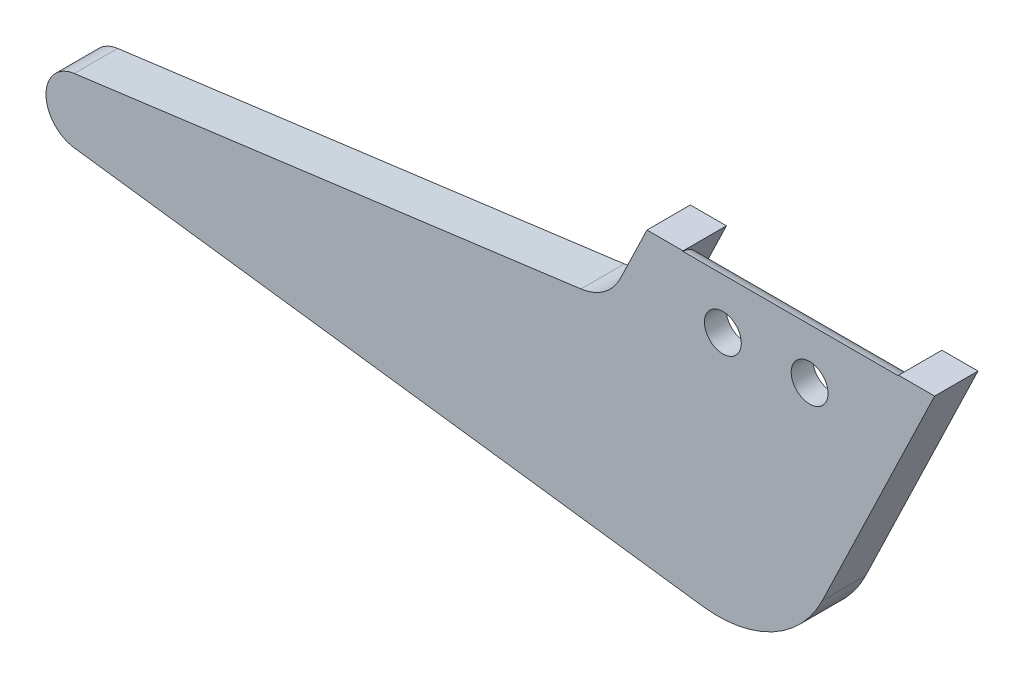
ISO-10303-21;
HEADER;
FILE_DESCRIPTION(('STEP AP214'),'2;1');
FILE_NAME('part.step','',(''),(''),'','','');
FILE_SCHEMA(('AUTOMOTIVE_DESIGN { 1 0 10303 214 1 1 1 1 }'));
ENDSEC;
DATA;
#1=APPLICATION_CONTEXT('core data for automotive mechanical design processes');
#2=APPLICATION_PROTOCOL_DEFINITION('international standard','automotive_design',2000,#1);
#3=PRODUCT_CONTEXT('',#1,'mechanical');
#4=PRODUCT('Part','Part','',(#3));
#5=PRODUCT_RELATED_PRODUCT_CATEGORY('part','',(#4));
#6=PRODUCT_DEFINITION_FORMATION('','',#4);
#7=PRODUCT_DEFINITION_CONTEXT('part definition',#1,'design');
#8=PRODUCT_DEFINITION('design','',#6,#7);
#9=PRODUCT_DEFINITION_SHAPE('','',#8);
#10=(LENGTH_UNIT() NAMED_UNIT(*) SI_UNIT(.MILLI.,.METRE.));
#11=(NAMED_UNIT(*) PLANE_ANGLE_UNIT() SI_UNIT($,.RADIAN.));
#12=(NAMED_UNIT(*) SI_UNIT($,.STERADIAN.) SOLID_ANGLE_UNIT());
#13=UNCERTAINTY_MEASURE_WITH_UNIT(LENGTH_MEASURE(1.E-05),#10,'distance_accuracy_value','');
#14=(GEOMETRIC_REPRESENTATION_CONTEXT(3) GLOBAL_UNCERTAINTY_ASSIGNED_CONTEXT((#13)) GLOBAL_UNIT_ASSIGNED_CONTEXT((#10,
#11,#12)) REPRESENTATION_CONTEXT('',''));
#15=CARTESIAN_POINT('',(0.,0.,0.));
#16=DIRECTION('',(0.,0.,1.));
#17=DIRECTION('',(1.,0.,0.));
#18=AXIS2_PLACEMENT_3D('',#15,#16,#17);
#19=CARTESIAN_POINT('',(0.,16.875533228522,2.));
#20=DIRECTION('',(0.,-1.,0.));
#21=DIRECTION('',(0.,0.,-1.));
#22=AXIS2_PLACEMENT_3D('',#19,#20,#21);
#23=PLANE('',#22);
#24=DIRECTION('',(-1.,0.,0.));
#25=VECTOR('',#24,1.);
#26=CARTESIAN_POINT('',(0.,16.875533228522,2.));
#27=LINE('',#26,#25);
#28=CARTESIAN_POINT('',(-3.2021710332918,16.875533228522,2.));
#29=VERTEX_POINT('',#28);
#30=CARTESIAN_POINT('',(-6.53175349323844,16.875533228522,2.));
#31=VERTEX_POINT('',#30);
#32=EDGE_CURVE('E267',#29,#31,#27,.T.);
#33=ORIENTED_EDGE('',*,*,#32,.F.);
#34=DIRECTION('',(0.,0.,1.));
#35=VECTOR('',#34,1.);
#36=CARTESIAN_POINT('',(-3.2021710332918,16.875533228522,-2.));
#37=LINE('',#36,#35);
#38=CARTESIAN_POINT('',(-3.2021710332918,16.875533228522,-2.));
#39=VERTEX_POINT('',#38);
#40=EDGE_CURVE('E241',#39,#29,#37,.T.);
#41=ORIENTED_EDGE('',*,*,#40,.F.);
#42=DIRECTION('',(-1.,0.,0.));
#43=VECTOR('',#42,1.);
#44=CARTESIAN_POINT('',(0.,16.875533228522,-2.));
#45=LINE('',#44,#43);
#46=CARTESIAN_POINT('',(-6.53175349323844,16.875533228522,-2.));
#47=VERTEX_POINT('',#46);
#48=EDGE_CURVE('E205',#39,#47,#45,.T.);
#49=ORIENTED_EDGE('',*,*,#48,.T.);
#50=DIRECTION('',(0.,0.,-1.));
#51=VECTOR('',#50,1.);
#52=CARTESIAN_POINT('',(-6.53175349323844,16.875533228522,2.));
#53=LINE('',#52,#51);
#54=EDGE_CURVE('E304',#31,#47,#53,.T.);
#55=ORIENTED_EDGE('',*,*,#54,.F.);
#56=EDGE_LOOP('',(#33,#41,#49,#55));
#57=FACE_BOUND('',#56,.T.);
#58=ADVANCED_FACE('F41',(#57),#23,.F.);
#59=DIRECTION('',(0.,0.,1.));
#60=VECTOR('',#59,1.);
#61=CARTESIAN_POINT('',(16.6637454586975,16.875533228522,-2.));
#62=LINE('',#61,#60);
#63=CARTESIAN_POINT('',(16.6637454586975,16.875533228522,-2.));
#64=VERTEX_POINT('',#63);
#65=CARTESIAN_POINT('',(16.6637454586975,16.875533228522,2.));
#66=VERTEX_POINT('',#65);
#67=EDGE_CURVE('E56',#64,#66,#62,.T.);
#68=ORIENTED_EDGE('',*,*,#67,.T.);
#69=CARTESIAN_POINT('',(19.9933279186442,16.875533228522,2.));
#70=VERTEX_POINT('',#69);
#71=EDGE_CURVE('E263',#70,#66,#27,.T.);
#72=ORIENTED_EDGE('',*,*,#71,.F.);
#73=DIRECTION('',(0.,0.,-1.));
#74=VECTOR('',#73,1.);
#75=CARTESIAN_POINT('',(19.9933279186442,16.875533228522,2.));
#76=LINE('',#75,#74);
#77=CARTESIAN_POINT('',(19.9933279186442,16.875533228522,-2.));
#78=VERTEX_POINT('',#77);
#79=EDGE_CURVE('E289',#70,#78,#76,.T.);
#80=ORIENTED_EDGE('',*,*,#79,.T.);
#81=EDGE_CURVE('E202',#78,#64,#45,.T.);
#82=ORIENTED_EDGE('',*,*,#81,.T.);
#83=EDGE_LOOP('',(#68,#72,#80,#82));
#84=FACE_BOUND('',#83,.T.);
#85=ADVANCED_FACE('F379',(#84),#23,.F.);
#86=CARTESIAN_POINT('',(-11.8984672041856,5.72847918898119,2.));
#87=DIRECTION('',(0.901013876691335,-0.433790265001016,0.));
#88=DIRECTION('',(0.433790265001016,0.901013876691335,0.));
#89=AXIS2_PLACEMENT_3D('',#86,#87,#88);
#90=PLANE('',#89);
#91=ORIENTED_EDGE('',*,*,#54,.T.);
#92=DIRECTION('',(-0.433790265001016,-0.901013876691335,0.));
#93=VECTOR('',#92,1.);
#94=CARTESIAN_POINT('',(-11.8984672041856,5.72847918898119,-2.));
#95=LINE('',#94,#93);
#96=CARTESIAN_POINT('',(-9.0017238432525,11.7452254739817,-2.));
#97=VERTEX_POINT('',#96);
#98=EDGE_CURVE('E222',#47,#97,#95,.T.);
#99=ORIENTED_EDGE('',*,*,#98,.T.);
#100=DIRECTION('',(0.,0.,-1.));
#101=VECTOR('',#100,1.);
#102=CARTESIAN_POINT('',(-9.0017238432525,11.7452254739817,2.));
#103=LINE('',#102,#101);
#104=CARTESIAN_POINT('',(-9.0017238432525,11.7452254739817,2.));
#105=VERTEX_POINT('',#104);
#106=EDGE_CURVE('E302',#105,#97,#103,.T.);
#107=ORIENTED_EDGE('',*,*,#106,.F.);
#108=DIRECTION('',(-0.433790265001016,-0.901013876691335,0.));
#109=VECTOR('',#108,1.);
#110=CARTESIAN_POINT('',(-11.8984672041856,5.72847918898119,2.));
#111=LINE('',#110,#109);
#112=EDGE_CURVE('E266',#31,#105,#111,.T.);
#113=ORIENTED_EDGE('',*,*,#112,.F.);
#114=EDGE_LOOP('',(#91,#99,#107,#113));
#115=FACE_BOUND('',#114,.T.);
#116=ADVANCED_FACE('F362',(#115),#90,.F.);
#117=CARTESIAN_POINT('',(-13.2364890637018,13.7840397194865,2.));
#118=DIRECTION('',(0.,0.,-1.));
#119=DIRECTION('',(-1.,0.,0.));
#120=AXIS2_PLACEMENT_3D('',#117,#118,#119);
#121=CYLINDRICAL_SURFACE('',#120,4.7);
#122=ORIENTED_EDGE('',*,*,#106,.T.);
#123=CARTESIAN_POINT('',(-13.2364890637018,13.7840397194865,-2.));
#124=DIRECTION('',(0.,0.,1.));
#125=DIRECTION('',(1.,0.,0.));
#126=AXIS2_PLACEMENT_3D('',#123,#124,#125);
#127=CIRCLE('',#126,4.7);
#128=CARTESIAN_POINT('',(-12.6230159602675,9.12424887102956,-2.));
#129=VERTEX_POINT('',#128);
#130=EDGE_CURVE('E225',#97,#129,#127,.F.);
#131=ORIENTED_EDGE('',*,*,#130,.T.);
#132=DIRECTION('',(0.,0.,-1.));
#133=VECTOR('',#132,1.);
#134=CARTESIAN_POINT('',(-12.6230159602675,9.12424887102956,2.));
#135=LINE('',#134,#133);
#136=CARTESIAN_POINT('',(-12.6230159602675,9.12424887102956,2.));
#137=VERTEX_POINT('',#136);
#138=EDGE_CURVE('E175',#137,#129,#135,.T.);
#139=ORIENTED_EDGE('',*,*,#138,.F.);
#140=CARTESIAN_POINT('',(-13.2364890637018,13.7840397194865,2.));
#141=DIRECTION('',(0.,0.,1.));
#142=DIRECTION('',(1.,0.,0.));
#143=AXIS2_PLACEMENT_3D('',#140,#141,#142);
#144=CIRCLE('',#143,4.7);
#145=EDGE_CURVE('E269',#105,#137,#144,.F.);
#146=ORIENTED_EDGE('',*,*,#145,.F.);
#147=EDGE_LOOP('',(#122,#131,#139,#146));
#148=FACE_BOUND('',#147,.T.);
#149=ADVANCED_FACE('F365',(#148),#121,.F.);
#150=CARTESIAN_POINT('',(-1.39582410933184,10.6023367190981,2.));
#151=DIRECTION('',(0.130526192220053,-0.99144486137381,0.));
#152=DIRECTION('',(0.99144486137381,0.130526192220053,0.));
#153=AXIS2_PLACEMENT_3D('',#150,#151,#152);
#154=PLANE('',#153);
#155=ORIENTED_EDGE('',*,*,#138,.T.);
#156=DIRECTION('',(-0.99144486137381,-0.130526192220053,0.));
#157=VECTOR('',#156,1.);
#158=CARTESIAN_POINT('',(-1.39582410933184,10.6023367190981,-2.));
#159=LINE('',#158,#157);
#160=CARTESIAN_POINT('',(-59.3362526979567,2.97433458412143,-2.));
#161=VERTEX_POINT('',#160);
#162=EDGE_CURVE('E183',#129,#161,#159,.T.);
#163=ORIENTED_EDGE('',*,*,#162,.T.);
#164=DIRECTION('',(0.,0.,-1.));
#165=VECTOR('',#164,1.);
#166=CARTESIAN_POINT('',(-59.3362526979567,2.97433458412143,2.));
#167=LINE('',#166,#165);
#168=CARTESIAN_POINT('',(-59.3362526979567,2.97433458412143,2.));
#169=VERTEX_POINT('',#168);
#170=EDGE_CURVE('E166',#169,#161,#167,.T.);
#171=ORIENTED_EDGE('',*,*,#170,.F.);
#172=DIRECTION('',(-0.99144486137381,-0.130526192220053,0.));
#173=VECTOR('',#172,1.);
#174=CARTESIAN_POINT('',(-1.39582410933184,10.6023367190981,2.));
#175=LINE('',#174,#173);
#176=EDGE_CURVE('E271',#137,#169,#175,.T.);
#177=ORIENTED_EDGE('',*,*,#176,.F.);
#178=EDGE_LOOP('',(#155,#163,#171,#177));
#179=FACE_BOUND('',#178,.T.);
#180=ADVANCED_FACE('F189',(#179),#154,.F.);
#181=CARTESIAN_POINT('',(-58.9446741212965,0.,2.));
#182=DIRECTION('',(0.,0.,-1.));
#183=DIRECTION('',(-1.,0.,0.));
#184=AXIS2_PLACEMENT_3D('',#181,#182,#183);
#185=CYLINDRICAL_SURFACE('',#184,3.);
#186=ORIENTED_EDGE('',*,*,#170,.T.);
#187=CARTESIAN_POINT('',(-58.9446741212965,0.,-2.));
#188=DIRECTION('',(0.,0.,1.));
#189=DIRECTION('',(1.,0.,0.));
#190=AXIS2_PLACEMENT_3D('',#187,#188,#189);
#191=CIRCLE('',#190,3.);
#192=CARTESIAN_POINT('',(-59.3362526979567,-2.97433458412143,-2.));
#193=VERTEX_POINT('',#192);
#194=EDGE_CURVE('E170',#161,#193,#191,.T.);
#195=ORIENTED_EDGE('',*,*,#194,.T.);
#196=DIRECTION('',(0.,0.,-1.));
#197=VECTOR('',#196,1.);
#198=CARTESIAN_POINT('',(-59.3362526979567,-2.97433458412143,2.));
#199=LINE('',#198,#197);
#200=CARTESIAN_POINT('',(-59.3362526979567,-2.97433458412143,2.));
#201=VERTEX_POINT('',#200);
#202=EDGE_CURVE('E176',#201,#193,#199,.T.);
#203=ORIENTED_EDGE('',*,*,#202,.F.);
#204=CARTESIAN_POINT('',(-58.9446741212965,0.,2.));
#205=DIRECTION('',(0.,0.,1.));
#206=DIRECTION('',(1.,0.,0.));
#207=AXIS2_PLACEMENT_3D('',#204,#205,#206);
#208=CIRCLE('',#207,3.);
#209=EDGE_CURVE('E171',#169,#201,#208,.T.);
#210=ORIENTED_EDGE('',*,*,#209,.F.);
#211=EDGE_LOOP('',(#186,#195,#203,#210));
#212=FACE_BOUND('',#211,.T.);
#213=ADVANCED_FACE('F168',(#212),#185,.T.);
#214=CARTESIAN_POINT('',(-1.39582410933184,-10.6023367190981,2.));
#215=DIRECTION('',(-0.130526192220053,-0.99144486137381,0.));
#216=DIRECTION('',(0.99144486137381,-0.130526192220053,0.));
#217=AXIS2_PLACEMENT_3D('',#214,#215,#216);
#218=PLANE('',#217);
#219=ORIENTED_EDGE('',*,*,#202,.T.);
#220=DIRECTION('',(-0.99144486137381,0.130526192220053,0.));
#221=VECTOR('',#220,1.);
#222=CARTESIAN_POINT('',(-1.39582410933184,-10.6023367190981,-2.));
#223=LINE('',#222,#221);
#224=CARTESIAN_POINT('',(-1.39582410933183,-10.6023367190981,-2.));
#225=VERTEX_POINT('',#224);
#226=EDGE_CURVE('E187',#225,#193,#223,.T.);
#227=ORIENTED_EDGE('',*,*,#226,.F.);
#228=DIRECTION('',(0.,0.,-1.));
#229=VECTOR('',#228,1.);
#230=CARTESIAN_POINT('',(-1.39582410933183,-10.6023367190981,2.));
#231=LINE('',#230,#229);
#232=CARTESIAN_POINT('',(-1.39582410933183,-10.6023367190981,2.));
#233=VERTEX_POINT('',#232);
#234=EDGE_CURVE('E298',#233,#225,#231,.T.);
#235=ORIENTED_EDGE('',*,*,#234,.F.);
#236=DIRECTION('',(-0.99144486137381,0.130526192220053,0.));
#237=VECTOR('',#236,1.);
#238=CARTESIAN_POINT('',(-1.39582410933184,-10.6023367190981,2.));
#239=LINE('',#238,#237);
#240=EDGE_CURVE('E274',#233,#201,#239,.T.);
#241=ORIENTED_EDGE('',*,*,#240,.T.);
#242=EDGE_LOOP('',(#219,#227,#235,#241));
#243=FACE_BOUND('',#242,.T.);
#244=ADVANCED_FACE('F369',(#243),#218,.T.);
#245=CARTESIAN_POINT('',(0.,0.,2.));
#246=DIRECTION('',(0.,0.,-1.));
#247=DIRECTION('',(-1.,0.,0.));
#248=AXIS2_PLACEMENT_3D('',#245,#246,#247);
#249=CYLINDRICAL_SURFACE('',#248,10.6938238647047);
#250=ORIENTED_EDGE('',*,*,#234,.T.);
#251=CARTESIAN_POINT('',(0.,0.,-2.));
#252=DIRECTION('',(0.,0.,1.));
#253=DIRECTION('',(1.,0.,0.));
#254=AXIS2_PLACEMENT_3D('',#251,#252,#253);
#255=CIRCLE('',#254,10.6938238647047);
#256=CARTESIAN_POINT('',(9.63528369699188,-4.63887668814443,-2.));
#257=VERTEX_POINT('',#256);
#258=EDGE_CURVE('E197',#257,#225,#255,.F.);
#259=ORIENTED_EDGE('',*,*,#258,.F.);
#260=DIRECTION('',(0.,0.,-1.));
#261=VECTOR('',#260,1.);
#262=CARTESIAN_POINT('',(9.63528369699188,-4.63887668814443,2.));
#263=LINE('',#262,#261);
#264=CARTESIAN_POINT('',(9.63528369699188,-4.63887668814443,2.));
#265=VERTEX_POINT('',#264);
#266=EDGE_CURVE('E296',#265,#257,#263,.T.);
#267=ORIENTED_EDGE('',*,*,#266,.F.);
#268=CARTESIAN_POINT('',(0.,0.,2.));
#269=DIRECTION('',(0.,0.,1.));
#270=DIRECTION('',(1.,0.,0.));
#271=AXIS2_PLACEMENT_3D('',#268,#269,#270);
#272=CIRCLE('',#271,10.6938238647047);
#273=EDGE_CURVE('E277',#265,#233,#272,.F.);
#274=ORIENTED_EDGE('',*,*,#273,.T.);
#275=EDGE_LOOP('',(#250,#259,#267,#274));
#276=FACE_BOUND('',#275,.T.);
#277=ADVANCED_FACE('F372',(#276),#249,.T.);
#278=CARTESIAN_POINT('',(8.46798716239551,12.175533228522,2.));
#279=DIRECTION('',(0.,0.,-1.));
#280=DIRECTION('',(-1.,0.,0.));
#281=AXIS2_PLACEMENT_3D('',#278,#279,#280);
#282=CYLINDRICAL_SURFACE('',#281,1.7);
#283=CARTESIAN_POINT('',(8.46798716239551,12.175533228522,2.));
#284=DIRECTION('',(0.,0.,1.));
#285=DIRECTION('',(1.,0.,0.));
#286=AXIS2_PLACEMENT_3D('',#283,#284,#285);
#287=CIRCLE('',#286,1.7);
#288=CARTESIAN_POINT('',(10.1679871623955,12.175533228522,2.));
#289=VERTEX_POINT('',#288);
#290=EDGE_CURVE('E283',#289,#289,#287,.T.);
#291=ORIENTED_EDGE('',*,*,#290,.T.);
#292=EDGE_LOOP('',(#291));
#293=FACE_BOUND('',#292,.T.);
#294=CARTESIAN_POINT('',(8.46798716239551,12.175533228522,0.));
#295=DIRECTION('',(0.,0.,1.));
#296=DIRECTION('',(1.,0.,0.));
#297=AXIS2_PLACEMENT_3D('',#294,#295,#296);
#298=CIRCLE('',#297,1.7);
#299=CARTESIAN_POINT('',(10.1679871623955,12.175533228522,0.));
#300=VERTEX_POINT('',#299);
#301=EDGE_CURVE('E243',#300,#300,#298,.T.);
#302=ORIENTED_EDGE('',*,*,#301,.F.);
#303=EDGE_LOOP('',(#302));
#304=FACE_BOUND('',#303,.T.);
#305=ADVANCED_FACE('F398',(#293,#304),#282,.F.);
#306=CARTESIAN_POINT('',(9.63528369699188,-4.63887668814442,2.));
#307=DIRECTION('',(0.901013876691335,-0.433790265001015,0.));
#308=DIRECTION('',(0.433790265001015,0.901013876691335,0.));
#309=AXIS2_PLACEMENT_3D('',#306,#307,#308);
#310=PLANE('',#309);
#311=ORIENTED_EDGE('',*,*,#266,.T.);
#312=DIRECTION('',(-0.433790265001015,-0.901013876691335,0.));
#313=VECTOR('',#312,1.);
#314=CARTESIAN_POINT('',(9.63528369699188,-4.63887668814442,-2.));
#315=LINE('',#314,#313);
#316=EDGE_CURVE('E199',#78,#257,#315,.T.);
#317=ORIENTED_EDGE('',*,*,#316,.F.);
#318=ORIENTED_EDGE('',*,*,#79,.F.);
#319=DIRECTION('',(-0.433790265001015,-0.901013876691335,0.));
#320=VECTOR('',#319,1.);
#321=CARTESIAN_POINT('',(9.63528369699188,-4.63887668814442,2.));
#322=LINE('',#321,#320);
#323=EDGE_CURVE('E280',#70,#265,#322,.T.);
#324=ORIENTED_EDGE('',*,*,#323,.T.);
#325=EDGE_LOOP('',(#311,#317,#318,#324));
#326=FACE_BOUND('',#325,.T.);
#327=ADVANCED_FACE('F376',(#326),#310,.T.);
#328=CARTESIAN_POINT('',(0.467987162395512,12.175533228522,2.));
#329=DIRECTION('',(0.,0.,-1.));
#330=DIRECTION('',(-1.,0.,0.));
#331=AXIS2_PLACEMENT_3D('',#328,#329,#330);
#332=CYLINDRICAL_SURFACE('',#331,1.7);
#333=CARTESIAN_POINT('',(0.467987162395512,12.175533228522,2.));
#334=DIRECTION('',(0.,0.,1.));
#335=DIRECTION('',(1.,0.,0.));
#336=AXIS2_PLACEMENT_3D('',#333,#334,#335);
#337=CIRCLE('',#336,1.7);
#338=CARTESIAN_POINT('',(2.16798716239551,12.175533228522,2.));
#339=VERTEX_POINT('',#338);
#340=EDGE_CURVE('E286',#339,#339,#337,.T.);
#341=ORIENTED_EDGE('',*,*,#340,.T.);
#342=EDGE_LOOP('',(#341));
#343=FACE_BOUND('',#342,.T.);
#344=CARTESIAN_POINT('',(0.467987162395512,12.175533228522,0.));
#345=DIRECTION('',(0.,0.,1.));
#346=DIRECTION('',(1.,0.,0.));
#347=AXIS2_PLACEMENT_3D('',#344,#345,#346);
#348=CIRCLE('',#347,1.7);
#349=CARTESIAN_POINT('',(2.16798716239551,12.175533228522,0.));
#350=VERTEX_POINT('',#349);
#351=EDGE_CURVE('E292',#350,#350,#348,.T.);
#352=ORIENTED_EDGE('',*,*,#351,.F.);
#353=EDGE_LOOP('',(#352));
#354=FACE_BOUND('',#353,.T.);
#355=ADVANCED_FACE('F401',(#343,#354),#332,.F.);
#356=CARTESIAN_POINT('',(0.,0.,2.));
#357=DIRECTION('',(0.,0.,1.));
#358=DIRECTION('',(1.,0.,0.));
#359=AXIS2_PLACEMENT_3D('',#356,#357,#358);
#360=PLANE('',#359);
#361=DIRECTION('',(-1.,0.,0.));
#362=VECTOR('',#361,1.);
#363=CARTESIAN_POINT('',(6.70646921002812,16.8250229713052,2.));
#364=LINE('',#363,#362);
#365=CARTESIAN_POINT('',(16.6394274560228,16.8250229713052,2.));
#366=VERTEX_POINT('',#365);
#367=CARTESIAN_POINT('',(-3.22648903596654,16.8250229713052,2.));
#368=VERTEX_POINT('',#367);
#369=EDGE_CURVE('E309',#366,#368,#364,.T.);
#370=ORIENTED_EDGE('',*,*,#369,.T.);
#371=DIRECTION('',(0.433790265001016,0.901013876691335,0.));
#372=VECTOR('',#371,1.);
#373=CARTESIAN_POINT('',(-9.19542557411162,4.42710839397814,2.));
#374=LINE('',#373,#372);
#375=EDGE_CURVE('E312',#368,#29,#374,.T.);
#376=ORIENTED_EDGE('',*,*,#375,.T.);
#377=ORIENTED_EDGE('',*,*,#32,.T.);
#378=ORIENTED_EDGE('',*,*,#112,.T.);
#379=ORIENTED_EDGE('',*,*,#145,.T.);
#380=ORIENTED_EDGE('',*,*,#176,.T.);
#381=ORIENTED_EDGE('',*,*,#209,.T.);
#382=ORIENTED_EDGE('',*,*,#240,.F.);
#383=ORIENTED_EDGE('',*,*,#273,.F.);
#384=ORIENTED_EDGE('',*,*,#323,.F.);
#385=ORIENTED_EDGE('',*,*,#71,.T.);
#386=DIRECTION('',(-0.433790265001015,-0.901013876691335,0.));
#387=VECTOR('',#386,1.);
#388=CARTESIAN_POINT('',(6.93224206691787,-3.33750589314138,2.));
#389=LINE('',#388,#387);
#390=EDGE_CURVE('E306',#66,#366,#389,.T.);
#391=ORIENTED_EDGE('',*,*,#390,.T.);
#392=EDGE_LOOP('',(#370,#376,#377,#378,#379,#380,#381,#382,#383,#384,#385,#391));
#393=FACE_BOUND('',#392,.T.);
#394=ORIENTED_EDGE('',*,*,#290,.F.);
#395=EDGE_LOOP('',(#394));
#396=FACE_BOUND('',#395,.T.);
#397=ORIENTED_EDGE('',*,*,#340,.F.);
#398=EDGE_LOOP('',(#397));
#399=FACE_BOUND('',#398,.T.);
#400=ADVANCED_FACE('F358',(#393,#396,#399),#360,.T.);
#401=CARTESIAN_POINT('',(0.,0.,0.));
#402=DIRECTION('',(0.,0.,1.));
#403=DIRECTION('',(1.,0.,0.));
#404=AXIS2_PLACEMENT_3D('',#401,#402,#403);
#405=PLANE('',#404);
#406=DIRECTION('',(-0.433790265001016,-0.901013876691335,0.));
#407=VECTOR('',#406,1.);
#408=CARTESIAN_POINT('',(-9.19542557411162,4.42710839397814,0.));
#409=LINE('',#408,#407);
#410=CARTESIAN_POINT('',(-4.40578808132762,14.375533228522,0.));
#411=VERTEX_POINT('',#410);
#412=CARTESIAN_POINT('',(-6.2986822131785,10.4438546789786,0.));
#413=VERTEX_POINT('',#412);
#414=EDGE_CURVE('E191',#411,#413,#409,.T.);
#415=ORIENTED_EDGE('',*,*,#414,.F.);
#416=DIRECTION('',(-1.,0.,0.));
#417=VECTOR('',#416,1.);
#418=CARTESIAN_POINT('',(0.,14.375533228522,0.));
#419=LINE('',#418,#417);
#420=CARTESIAN_POINT('',(15.4601284106617,14.375533228522,0.));
#421=VERTEX_POINT('',#420);
#422=EDGE_CURVE('E315',#411,#421,#419,.F.);
#423=ORIENTED_EDGE('',*,*,#422,.T.);
#424=DIRECTION('',(-0.433790265001015,-0.901013876691335,0.));
#425=VECTOR('',#424,1.);
#426=CARTESIAN_POINT('',(6.93224206691787,-3.33750589314138,0.));
#427=LINE('',#426,#425);
#428=CARTESIAN_POINT('',(6.93224206691787,-3.33750589314138,0.));
#429=VERTEX_POINT('',#428);
#430=EDGE_CURVE('E227',#421,#429,#427,.T.);
#431=ORIENTED_EDGE('',*,*,#430,.T.);
#432=CARTESIAN_POINT('',(0.,0.,0.));
#433=DIRECTION('',(0.,0.,1.));
#434=DIRECTION('',(1.,0.,0.));
#435=AXIS2_PLACEMENT_3D('',#432,#433,#434);
#436=CIRCLE('',#435,7.69382386470471);
#437=CARTESIAN_POINT('',(-1.00424553267167,-7.6280021349767,0.));
#438=VERTEX_POINT('',#437);
#439=EDGE_CURVE('E229',#429,#438,#436,.F.);
#440=ORIENTED_EDGE('',*,*,#439,.T.);
#441=DIRECTION('',(-0.99144486137381,0.130526192220053,0.));
#442=VECTOR('',#441,1.);
#443=CARTESIAN_POINT('',(-1.00424553267168,-7.6280021349767,0.));
#444=LINE('',#443,#442);
#445=CARTESIAN_POINT('',(-51.4139027379762,-0.991444861373811,0.));
#446=VERTEX_POINT('',#445);
#447=EDGE_CURVE('E231',#438,#446,#444,.T.);
#448=ORIENTED_EDGE('',*,*,#447,.T.);
#449=CARTESIAN_POINT('',(-51.2833765457561,0.,0.));
#450=DIRECTION('',(0.,0.,1.));
#451=DIRECTION('',(1.,0.,0.));
#452=AXIS2_PLACEMENT_3D('',#449,#450,#451);
#453=CIRCLE('',#452,1.);
#454=CARTESIAN_POINT('',(-51.4139027379762,0.991444861373812,0.));
#455=VERTEX_POINT('',#454);
#456=EDGE_CURVE('E233',#455,#446,#453,.T.);
#457=ORIENTED_EDGE('',*,*,#456,.F.);
#458=DIRECTION('',(-0.99144486137381,-0.130526192220053,0.));
#459=VECTOR('',#458,1.);
#460=CARTESIAN_POINT('',(-1.00424553267168,7.62800213497668,0.));
#461=LINE('',#460,#459);
#462=CARTESIAN_POINT('',(-12.2314373836074,6.14991428690812,0.));
#463=VERTEX_POINT('',#462);
#464=EDGE_CURVE('E236',#463,#455,#461,.T.);
#465=ORIENTED_EDGE('',*,*,#464,.F.);
#466=CARTESIAN_POINT('',(-13.2364890637018,13.7840397194865,0.));
#467=DIRECTION('',(0.,0.,1.));
#468=DIRECTION('',(1.,0.,0.));
#469=AXIS2_PLACEMENT_3D('',#466,#467,#468);
#470=CIRCLE('',#469,7.70000000000001);
#471=EDGE_CURVE('E193',#413,#463,#470,.F.);
#472=ORIENTED_EDGE('',*,*,#471,.F.);
#473=EDGE_LOOP('',(#415,#423,#431,#440,#448,#457,#465,#472));
#474=FACE_BOUND('',#473,.T.);
#475=ORIENTED_EDGE('',*,*,#301,.T.);
#476=EDGE_LOOP('',(#475));
#477=FACE_BOUND('',#476,.T.);
#478=ORIENTED_EDGE('',*,*,#351,.T.);
#479=EDGE_LOOP('',(#478));
#480=FACE_BOUND('',#479,.T.);
#481=ADVANCED_FACE('F320',(#474,#477,#480),#405,.F.);
#482=CARTESIAN_POINT('',(-9.19542557411162,4.42710839397814,-2.));
#483=DIRECTION('',(-0.901013876691335,0.433790265001015,0.));
#484=DIRECTION('',(-0.433790265001016,-0.901013876691335,0.));
#485=AXIS2_PLACEMENT_3D('',#482,#483,#484);
#486=PLANE('',#485);
#487=ORIENTED_EDGE('',*,*,#40,.T.);
#488=ORIENTED_EDGE('',*,*,#375,.F.);
#489=CARTESIAN_POINT('',(-4.40578808132763,14.375533228522,2.5));
#490=DIRECTION('',(-0.901013876691335,0.433790265001015,0.));
#491=DIRECTION('',(-0.433790265001016,-0.901013876691335,0.));
#492=AXIS2_PLACEMENT_3D('',#489,#490,#491);
#493=ELLIPSE('',#492,2.77465204995554,2.5);
#494=EDGE_CURVE('E49',#368,#411,#493,.T.);
#495=ORIENTED_EDGE('',*,*,#494,.T.);
#496=ORIENTED_EDGE('',*,*,#414,.T.);
#497=DIRECTION('',(0.,0.,1.));
#498=VECTOR('',#497,1.);
#499=CARTESIAN_POINT('',(-6.2986822131785,10.4438546789786,-2.));
#500=LINE('',#499,#498);
#501=CARTESIAN_POINT('',(-6.2986822131785,10.4438546789786,-2.));
#502=VERTEX_POINT('',#501);
#503=EDGE_CURVE('E244',#502,#413,#500,.T.);
#504=ORIENTED_EDGE('',*,*,#503,.F.);
#505=DIRECTION('',(-0.433790265001016,-0.901013876691335,0.));
#506=VECTOR('',#505,1.);
#507=CARTESIAN_POINT('',(-9.19542557411162,4.42710839397814,-2.));
#508=LINE('',#507,#506);
#509=EDGE_CURVE('E220',#39,#502,#508,.T.);
#510=ORIENTED_EDGE('',*,*,#509,.F.);
#511=EDGE_LOOP('',(#487,#488,#495,#496,#504,#510));
#512=FACE_BOUND('',#511,.T.);
#513=ADVANCED_FACE('F349',(#512),#486,.F.);
#514=CARTESIAN_POINT('',(-13.2364890637018,13.7840397194865,-2.));
#515=DIRECTION('',(0.,0.,1.));
#516=DIRECTION('',(1.,0.,0.));
#517=AXIS2_PLACEMENT_3D('',#514,#515,#516);
#518=CYLINDRICAL_SURFACE('',#517,7.70000000000001);
#519=ORIENTED_EDGE('',*,*,#471,.T.);
#520=DIRECTION('',(0.,0.,1.));
#521=VECTOR('',#520,1.);
#522=CARTESIAN_POINT('',(-12.2314373836074,6.14991428690812,-2.));
#523=LINE('',#522,#521);
#524=CARTESIAN_POINT('',(-12.2314373836074,6.14991428690812,-2.));
#525=VERTEX_POINT('',#524);
#526=EDGE_CURVE('E247',#525,#463,#523,.T.);
#527=ORIENTED_EDGE('',*,*,#526,.F.);
#528=CARTESIAN_POINT('',(-13.2364890637018,13.7840397194865,-2.));
#529=DIRECTION('',(0.,0.,1.));
#530=DIRECTION('',(1.,0.,0.));
#531=AXIS2_PLACEMENT_3D('',#528,#529,#530);
#532=CIRCLE('',#531,7.70000000000001);
#533=EDGE_CURVE('E218',#502,#525,#532,.F.);
#534=ORIENTED_EDGE('',*,*,#533,.F.);
#535=ORIENTED_EDGE('',*,*,#503,.T.);
#536=EDGE_LOOP('',(#519,#527,#534,#535));
#537=FACE_BOUND('',#536,.T.);
#538=ADVANCED_FACE('F345',(#537),#518,.T.);
#539=CARTESIAN_POINT('',(-1.00424553267168,7.62800213497668,-2.));
#540=DIRECTION('',(-0.130526192220053,0.99144486137381,0.));
#541=DIRECTION('',(-0.99144486137381,-0.130526192220053,0.));
#542=AXIS2_PLACEMENT_3D('',#539,#540,#541);
#543=PLANE('',#542);
#544=ORIENTED_EDGE('',*,*,#464,.T.);
#545=DIRECTION('',(0.,0.,1.));
#546=VECTOR('',#545,1.);
#547=CARTESIAN_POINT('',(-51.4139027379762,0.991444861373812,-2.));
#548=LINE('',#547,#546);
#549=CARTESIAN_POINT('',(-51.4139027379762,0.991444861373812,-2.));
#550=VERTEX_POINT('',#549);
#551=EDGE_CURVE('E250',#550,#455,#548,.T.);
#552=ORIENTED_EDGE('',*,*,#551,.F.);
#553=DIRECTION('',(-0.99144486137381,-0.130526192220053,0.));
#554=VECTOR('',#553,1.);
#555=CARTESIAN_POINT('',(-1.00424553267168,7.62800213497668,-2.));
#556=LINE('',#555,#554);
#557=EDGE_CURVE('E216',#525,#550,#556,.T.);
#558=ORIENTED_EDGE('',*,*,#557,.F.);
#559=ORIENTED_EDGE('',*,*,#526,.T.);
#560=EDGE_LOOP('',(#544,#552,#558,#559));
#561=FACE_BOUND('',#560,.T.);
#562=ADVANCED_FACE('F342',(#561),#543,.F.);
#563=CARTESIAN_POINT('',(-51.2833765457561,0.,-2.));
#564=DIRECTION('',(0.,0.,1.));
#565=DIRECTION('',(1.,0.,0.));
#566=AXIS2_PLACEMENT_3D('',#563,#564,#565);
#567=CYLINDRICAL_SURFACE('',#566,1.);
#568=ORIENTED_EDGE('',*,*,#456,.T.);
#569=DIRECTION('',(0.,0.,1.));
#570=VECTOR('',#569,1.);
#571=CARTESIAN_POINT('',(-51.4139027379762,-0.991444861373811,-2.));
#572=LINE('',#571,#570);
#573=CARTESIAN_POINT('',(-51.4139027379762,-0.991444861373811,-2.));
#574=VERTEX_POINT('',#573);
#575=EDGE_CURVE('E253',#574,#446,#572,.T.);
#576=ORIENTED_EDGE('',*,*,#575,.F.);
#577=CARTESIAN_POINT('',(-51.2833765457561,0.,-2.));
#578=DIRECTION('',(0.,0.,1.));
#579=DIRECTION('',(1.,0.,0.));
#580=AXIS2_PLACEMENT_3D('',#577,#578,#579);
#581=CIRCLE('',#580,1.);
#582=EDGE_CURVE('E214',#550,#574,#581,.T.);
#583=ORIENTED_EDGE('',*,*,#582,.F.);
#584=ORIENTED_EDGE('',*,*,#551,.T.);
#585=EDGE_LOOP('',(#568,#576,#583,#584));
#586=FACE_BOUND('',#585,.T.);
#587=ADVANCED_FACE('F338',(#586),#567,.F.);
#588=CARTESIAN_POINT('',(-1.00424553267168,-7.6280021349767,-2.));
#589=DIRECTION('',(0.130526192220053,0.99144486137381,0.));
#590=DIRECTION('',(-0.99144486137381,0.130526192220053,0.));
#591=AXIS2_PLACEMENT_3D('',#588,#589,#590);
#592=PLANE('',#591);
#593=ORIENTED_EDGE('',*,*,#447,.F.);
#594=DIRECTION('',(0.,0.,1.));
#595=VECTOR('',#594,1.);
#596=CARTESIAN_POINT('',(-1.00424553267167,-7.6280021349767,-2.));
#597=LINE('',#596,#595);
#598=CARTESIAN_POINT('',(-1.00424553267167,-7.6280021349767,-2.));
#599=VERTEX_POINT('',#598);
#600=EDGE_CURVE('E256',#599,#438,#597,.T.);
#601=ORIENTED_EDGE('',*,*,#600,.F.);
#602=DIRECTION('',(-0.99144486137381,0.130526192220053,0.));
#603=VECTOR('',#602,1.);
#604=CARTESIAN_POINT('',(-1.00424553267168,-7.6280021349767,-2.));
#605=LINE('',#604,#603);
#606=EDGE_CURVE('E211',#599,#574,#605,.T.);
#607=ORIENTED_EDGE('',*,*,#606,.T.);
#608=ORIENTED_EDGE('',*,*,#575,.T.);
#609=EDGE_LOOP('',(#593,#601,#607,#608));
#610=FACE_BOUND('',#609,.T.);
#611=ADVANCED_FACE('F334',(#610),#592,.T.);
#612=CARTESIAN_POINT('',(0.,0.,-2.));
#613=DIRECTION('',(0.,0.,1.));
#614=DIRECTION('',(1.,0.,0.));
#615=AXIS2_PLACEMENT_3D('',#612,#613,#614);
#616=CYLINDRICAL_SURFACE('',#615,7.69382386470471);
#617=ORIENTED_EDGE('',*,*,#439,.F.);
#618=DIRECTION('',(0.,0.,1.));
#619=VECTOR('',#618,1.);
#620=CARTESIAN_POINT('',(6.93224206691787,-3.33750589314138,-2.));
#621=LINE('',#620,#619);
#622=CARTESIAN_POINT('',(6.93224206691787,-3.33750589314138,-2.));
#623=VERTEX_POINT('',#622);
#624=EDGE_CURVE('E259',#623,#429,#621,.T.);
#625=ORIENTED_EDGE('',*,*,#624,.F.);
#626=CARTESIAN_POINT('',(0.,0.,-2.));
#627=DIRECTION('',(0.,0.,1.));
#628=DIRECTION('',(1.,0.,0.));
#629=AXIS2_PLACEMENT_3D('',#626,#627,#628);
#630=CIRCLE('',#629,7.69382386470471);
#631=EDGE_CURVE('E208',#623,#599,#630,.F.);
#632=ORIENTED_EDGE('',*,*,#631,.T.);
#633=ORIENTED_EDGE('',*,*,#600,.T.);
#634=EDGE_LOOP('',(#617,#625,#632,#633));
#635=FACE_BOUND('',#634,.T.);
#636=ADVANCED_FACE('F330',(#635),#616,.F.);
#637=CARTESIAN_POINT('',(6.93224206691787,-3.33750589314138,-2.));
#638=DIRECTION('',(-0.901013876691335,0.433790265001015,0.));
#639=DIRECTION('',(-0.433790265001015,-0.901013876691335,0.));
#640=AXIS2_PLACEMENT_3D('',#637,#638,#639);
#641=PLANE('',#640);
#642=ORIENTED_EDGE('',*,*,#430,.F.);
#643=CARTESIAN_POINT('',(15.4601284106617,14.375533228522,2.5));
#644=DIRECTION('',(-0.901013876691335,0.433790265001015,0.));
#645=DIRECTION('',(-0.433790265001015,-0.901013876691335,0.));
#646=AXIS2_PLACEMENT_3D('',#643,#644,#645);
#647=ELLIPSE('',#646,2.77465204995554,2.5);
#648=EDGE_CURVE('E11',#421,#366,#647,.F.);
#649=ORIENTED_EDGE('',*,*,#648,.T.);
#650=ORIENTED_EDGE('',*,*,#390,.F.);
#651=ORIENTED_EDGE('',*,*,#67,.F.);
#652=DIRECTION('',(-0.433790265001015,-0.901013876691335,0.));
#653=VECTOR('',#652,1.);
#654=CARTESIAN_POINT('',(6.93224206691787,-3.33750589314138,-2.));
#655=LINE('',#654,#653);
#656=EDGE_CURVE('E204',#64,#623,#655,.T.);
#657=ORIENTED_EDGE('',*,*,#656,.T.);
#658=ORIENTED_EDGE('',*,*,#624,.T.);
#659=EDGE_LOOP('',(#642,#649,#650,#651,#657,#658));
#660=FACE_BOUND('',#659,.T.);
#661=ADVANCED_FACE('F325',(#660),#641,.T.);
#662=CARTESIAN_POINT('',(0.,0.,-2.));
#663=DIRECTION('',(0.,0.,1.));
#664=DIRECTION('',(1.,0.,0.));
#665=AXIS2_PLACEMENT_3D('',#662,#663,#664);
#666=PLANE('',#665);
#667=ORIENTED_EDGE('',*,*,#162,.F.);
#668=ORIENTED_EDGE('',*,*,#130,.F.);
#669=ORIENTED_EDGE('',*,*,#98,.F.);
#670=ORIENTED_EDGE('',*,*,#48,.F.);
#671=ORIENTED_EDGE('',*,*,#509,.T.);
#672=ORIENTED_EDGE('',*,*,#533,.T.);
#673=ORIENTED_EDGE('',*,*,#557,.T.);
#674=ORIENTED_EDGE('',*,*,#582,.T.);
#675=ORIENTED_EDGE('',*,*,#606,.F.);
#676=ORIENTED_EDGE('',*,*,#631,.F.);
#677=ORIENTED_EDGE('',*,*,#656,.F.);
#678=ORIENTED_EDGE('',*,*,#81,.F.);
#679=ORIENTED_EDGE('',*,*,#316,.T.);
#680=ORIENTED_EDGE('',*,*,#258,.T.);
#681=ORIENTED_EDGE('',*,*,#226,.T.);
#682=ORIENTED_EDGE('',*,*,#194,.F.);
#683=EDGE_LOOP('',(#667,#668,#669,#670,#671,#672,#673,#674,#675,#676,#677,#678,#679,#680,#681,#682));
#684=FACE_BOUND('',#683,.T.);
#685=ADVANCED_FACE('F181',(#684),#666,.F.);
#686=CARTESIAN_POINT('',(0.,14.375533228522,2.5));
#687=DIRECTION('',(-1.,0.,0.));
#688=DIRECTION('',(0.,0.,1.));
#689=AXIS2_PLACEMENT_3D('',#686,#687,#688);
#690=CYLINDRICAL_SURFACE('',#689,2.5);
#691=ORIENTED_EDGE('',*,*,#648,.F.);
#692=ORIENTED_EDGE('',*,*,#422,.F.);
#693=ORIENTED_EDGE('',*,*,#494,.F.);
#694=ORIENTED_EDGE('',*,*,#369,.F.);
#695=EDGE_LOOP('',(#691,#692,#693,#694));
#696=FACE_BOUND('',#695,.T.);
#697=ADVANCED_FACE('F43',(#696),#690,.T.);
#698=CLOSED_SHELL('',(#58,#85,#116,#149,#180,#213,#244,#277,#305,#327,#355,#400,#481,#513,#538,
#562,#587,#611,#636,#661,#685,#697));
#699=MANIFOLD_SOLID_BREP('B2',#698);
#700=ADVANCED_BREP_SHAPE_REPRESENTATION('',(#18,#699),#14);
#701=SHAPE_DEFINITION_REPRESENTATION(#9,#700);
ENDSEC;
END-ISO-10303-21;
